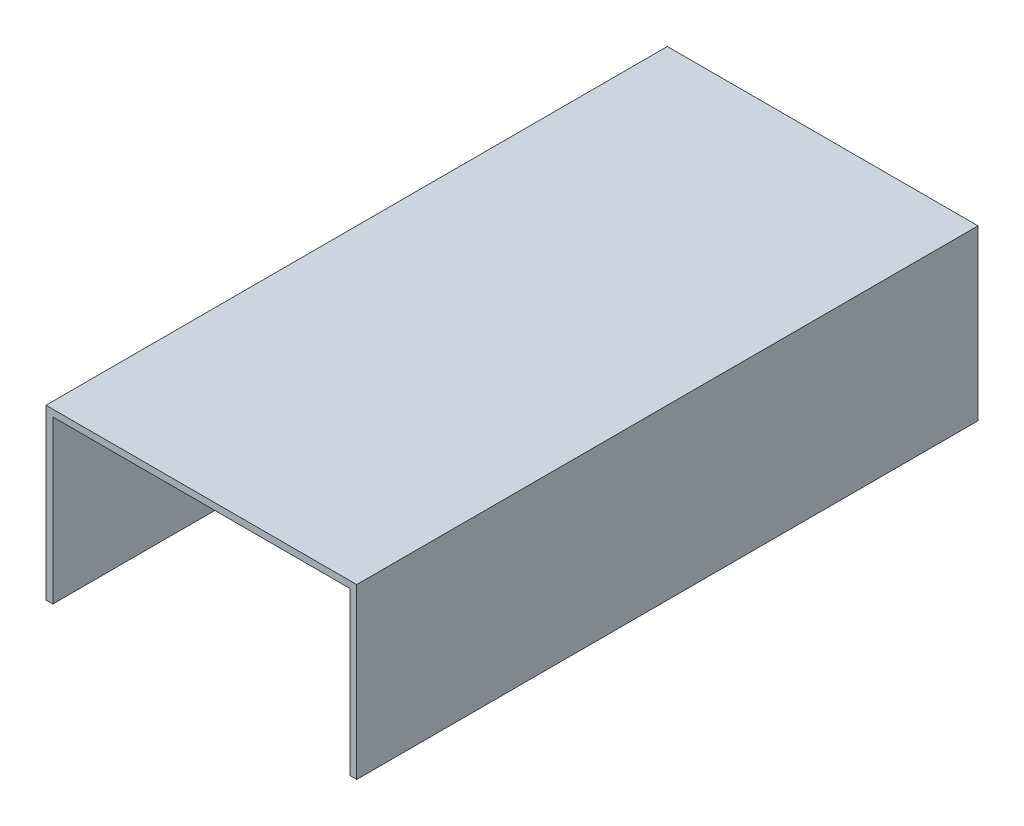
ISO-10303-21;
HEADER;
FILE_DESCRIPTION(('STEP AP214'),'2;1');
FILE_NAME('part.step','',(''),(''),'','','');
FILE_SCHEMA(('AUTOMOTIVE_DESIGN { 1 0 10303 214 1 1 1 1 }'));
ENDSEC;
DATA;
#1=APPLICATION_CONTEXT('core data for automotive mechanical design processes');
#2=APPLICATION_PROTOCOL_DEFINITION('international standard','automotive_design',2000,#1);
#3=PRODUCT_CONTEXT('',#1,'mechanical');
#4=PRODUCT('Part','Part','',(#3));
#5=PRODUCT_RELATED_PRODUCT_CATEGORY('part','',(#4));
#6=PRODUCT_DEFINITION_FORMATION('','',#4);
#7=PRODUCT_DEFINITION_CONTEXT('part definition',#1,'design');
#8=PRODUCT_DEFINITION('design','',#6,#7);
#9=PRODUCT_DEFINITION_SHAPE('','',#8);
#10=(LENGTH_UNIT() NAMED_UNIT(*) SI_UNIT(.MILLI.,.METRE.));
#11=(NAMED_UNIT(*) PLANE_ANGLE_UNIT() SI_UNIT($,.RADIAN.));
#12=(NAMED_UNIT(*) SI_UNIT($,.STERADIAN.) SOLID_ANGLE_UNIT());
#13=UNCERTAINTY_MEASURE_WITH_UNIT(LENGTH_MEASURE(1.E-05),#10,'distance_accuracy_value','');
#14=(GEOMETRIC_REPRESENTATION_CONTEXT(3) GLOBAL_UNCERTAINTY_ASSIGNED_CONTEXT((#13)) GLOBAL_UNIT_ASSIGNED_CONTEXT((#10,
#11,#12)) REPRESENTATION_CONTEXT('',''));
#15=CARTESIAN_POINT('',(0.,0.,0.));
#16=DIRECTION('',(0.,0.,1.));
#17=DIRECTION('',(1.,0.,0.));
#18=AXIS2_PLACEMENT_3D('',#15,#16,#17);
#19=CARTESIAN_POINT('',(142.875,0.,292.1));
#20=DIRECTION('',(-1.,0.,0.));
#21=DIRECTION('',(0.,0.,1.));
#22=AXIS2_PLACEMENT_3D('',#19,#20,#21);
#23=PLANE('',#22);
#24=DIRECTION('',(0.,1.,0.));
#25=VECTOR('',#24,1.);
#26=CARTESIAN_POINT('',(142.875,0.,0.));
#27=LINE('',#26,#25);
#28=CARTESIAN_POINT('',(142.875,0.,0.));
#29=VERTEX_POINT('',#28);
#30=CARTESIAN_POINT('',(142.875,76.2,0.));
#31=VERTEX_POINT('',#30);
#32=EDGE_CURVE('E130',#29,#31,#27,.T.);
#33=ORIENTED_EDGE('',*,*,#32,.F.);
#34=DIRECTION('',(0.,0.,-1.));
#35=VECTOR('',#34,1.);
#36=CARTESIAN_POINT('',(142.875,0.,292.1));
#37=LINE('',#36,#35);
#38=CARTESIAN_POINT('',(142.875,0.,292.1));
#39=VERTEX_POINT('',#38);
#40=EDGE_CURVE('E11',#39,#29,#37,.T.);
#41=ORIENTED_EDGE('',*,*,#40,.F.);
#42=DIRECTION('',(0.,1.,0.));
#43=VECTOR('',#42,1.);
#44=CARTESIAN_POINT('',(142.875,0.,292.1));
#45=LINE('',#44,#43);
#46=CARTESIAN_POINT('',(142.875,76.2,292.1));
#47=VERTEX_POINT('',#46);
#48=EDGE_CURVE('E147',#39,#47,#45,.T.);
#49=ORIENTED_EDGE('',*,*,#48,.T.);
#50=DIRECTION('',(0.,0.,-1.));
#51=VECTOR('',#50,1.);
#52=CARTESIAN_POINT('',(142.875,76.2,292.1));
#53=LINE('',#52,#51);
#54=EDGE_CURVE('E86',#47,#31,#53,.T.);
#55=ORIENTED_EDGE('',*,*,#54,.T.);
#56=EDGE_LOOP('',(#33,#41,#49,#55));
#57=FACE_BOUND('',#56,.T.);
#58=ADVANCED_FACE('F35',(#57),#23,.T.);
#59=CARTESIAN_POINT('',(0.,0.,292.1));
#60=DIRECTION('',(0.,1.,0.));
#61=DIRECTION('',(0.,0.,1.));
#62=AXIS2_PLACEMENT_3D('',#59,#60,#61);
#63=PLANE('',#62);
#64=DIRECTION('',(1.,0.,0.));
#65=VECTOR('',#64,1.);
#66=CARTESIAN_POINT('',(0.,0.,0.));
#67=LINE('',#66,#65);
#68=CARTESIAN_POINT('',(146.05,0.,0.));
#69=VERTEX_POINT('',#68);
#70=EDGE_CURVE('E133',#29,#69,#67,.T.);
#71=ORIENTED_EDGE('',*,*,#70,.T.);
#72=DIRECTION('',(0.,0.,-1.));
#73=VECTOR('',#72,1.);
#74=CARTESIAN_POINT('',(146.05,0.,292.1));
#75=LINE('',#74,#73);
#76=CARTESIAN_POINT('',(146.05,0.,292.1));
#77=VERTEX_POINT('',#76);
#78=EDGE_CURVE('E43',#77,#69,#75,.T.);
#79=ORIENTED_EDGE('',*,*,#78,.F.);
#80=DIRECTION('',(1.,0.,0.));
#81=VECTOR('',#80,1.);
#82=CARTESIAN_POINT('',(0.,0.,292.1));
#83=LINE('',#82,#81);
#84=EDGE_CURVE('E116',#39,#77,#83,.T.);
#85=ORIENTED_EDGE('',*,*,#84,.F.);
#86=ORIENTED_EDGE('',*,*,#40,.T.);
#87=EDGE_LOOP('',(#71,#79,#85,#86));
#88=FACE_BOUND('',#87,.T.);
#89=ADVANCED_FACE('F174',(#88),#63,.F.);
#90=CARTESIAN_POINT('',(146.05,0.,292.1));
#91=DIRECTION('',(-1.,0.,0.));
#92=DIRECTION('',(0.,0.,1.));
#93=AXIS2_PLACEMENT_3D('',#90,#91,#92);
#94=PLANE('',#93);
#95=DIRECTION('',(0.,1.,0.));
#96=VECTOR('',#95,1.);
#97=CARTESIAN_POINT('',(146.05,0.,0.));
#98=LINE('',#97,#96);
#99=CARTESIAN_POINT('',(146.05,79.375,0.));
#100=VERTEX_POINT('',#99);
#101=EDGE_CURVE('E135',#69,#100,#98,.T.);
#102=ORIENTED_EDGE('',*,*,#101,.T.);
#103=DIRECTION('',(0.,0.,-1.));
#104=VECTOR('',#103,1.);
#105=CARTESIAN_POINT('',(146.05,79.375,292.1));
#106=LINE('',#105,#104);
#107=CARTESIAN_POINT('',(146.05,79.375,292.1));
#108=VERTEX_POINT('',#107);
#109=EDGE_CURVE('E153',#108,#100,#106,.T.);
#110=ORIENTED_EDGE('',*,*,#109,.F.);
#111=DIRECTION('',(0.,1.,0.));
#112=VECTOR('',#111,1.);
#113=CARTESIAN_POINT('',(146.05,0.,292.1));
#114=LINE('',#113,#112);
#115=EDGE_CURVE('E161',#77,#108,#114,.T.);
#116=ORIENTED_EDGE('',*,*,#115,.F.);
#117=ORIENTED_EDGE('',*,*,#78,.T.);
#118=EDGE_LOOP('',(#102,#110,#116,#117));
#119=FACE_BOUND('',#118,.T.);
#120=ADVANCED_FACE('F159',(#119),#94,.F.);
#121=CARTESIAN_POINT('',(0.,79.375,292.1));
#122=DIRECTION('',(0.,1.,0.));
#123=DIRECTION('',(0.,0.,1.));
#124=AXIS2_PLACEMENT_3D('',#121,#122,#123);
#125=PLANE('',#124);
#126=DIRECTION('',(1.,0.,0.));
#127=VECTOR('',#126,1.);
#128=CARTESIAN_POINT('',(0.,79.375,0.));
#129=LINE('',#128,#127);
#130=CARTESIAN_POINT('',(0.,79.375,0.));
#131=VERTEX_POINT('',#130);
#132=EDGE_CURVE('E138',#131,#100,#129,.T.);
#133=ORIENTED_EDGE('',*,*,#132,.F.);
#134=DIRECTION('',(0.,0.,-1.));
#135=VECTOR('',#134,1.);
#136=CARTESIAN_POINT('',(0.,79.375,292.1));
#137=LINE('',#136,#135);
#138=CARTESIAN_POINT('',(0.,79.375,292.1));
#139=VERTEX_POINT('',#138);
#140=EDGE_CURVE('E151',#139,#131,#137,.T.);
#141=ORIENTED_EDGE('',*,*,#140,.F.);
#142=DIRECTION('',(1.,0.,0.));
#143=VECTOR('',#142,1.);
#144=CARTESIAN_POINT('',(0.,79.375,292.1));
#145=LINE('',#144,#143);
#146=EDGE_CURVE('E171',#139,#108,#145,.T.);
#147=ORIENTED_EDGE('',*,*,#146,.T.);
#148=ORIENTED_EDGE('',*,*,#109,.T.);
#149=EDGE_LOOP('',(#133,#141,#147,#148));
#150=FACE_BOUND('',#149,.T.);
#151=ADVANCED_FACE('F169',(#150),#125,.T.);
#152=CARTESIAN_POINT('',(0.,0.,292.1));
#153=DIRECTION('',(-1.,0.,0.));
#154=DIRECTION('',(0.,0.,1.));
#155=AXIS2_PLACEMENT_3D('',#152,#153,#154);
#156=PLANE('',#155);
#157=DIRECTION('',(0.,1.,0.));
#158=VECTOR('',#157,1.);
#159=CARTESIAN_POINT('',(0.,0.,0.));
#160=LINE('',#159,#158);
#161=CARTESIAN_POINT('',(0.,0.,0.));
#162=VERTEX_POINT('',#161);
#163=EDGE_CURVE('E141',#162,#131,#160,.T.);
#164=ORIENTED_EDGE('',*,*,#163,.F.);
#165=DIRECTION('',(0.,0.,-1.));
#166=VECTOR('',#165,1.);
#167=CARTESIAN_POINT('',(0.,0.,292.1));
#168=LINE('',#167,#166);
#169=CARTESIAN_POINT('',(0.,0.,292.1));
#170=VERTEX_POINT('',#169);
#171=EDGE_CURVE('E121',#170,#162,#168,.T.);
#172=ORIENTED_EDGE('',*,*,#171,.F.);
#173=DIRECTION('',(0.,1.,0.));
#174=VECTOR('',#173,1.);
#175=CARTESIAN_POINT('',(0.,0.,292.1));
#176=LINE('',#175,#174);
#177=EDGE_CURVE('E113',#170,#139,#176,.T.);
#178=ORIENTED_EDGE('',*,*,#177,.T.);
#179=ORIENTED_EDGE('',*,*,#140,.T.);
#180=EDGE_LOOP('',(#164,#172,#178,#179));
#181=FACE_BOUND('',#180,.T.);
#182=ADVANCED_FACE('F184',(#181),#156,.T.);
#183=CARTESIAN_POINT('',(3.17499999999999,0.,0.));
#184=VERTEX_POINT('',#183);
#185=EDGE_CURVE('E120',#162,#184,#67,.T.);
#186=ORIENTED_EDGE('',*,*,#185,.T.);
#187=DIRECTION('',(0.,0.,-1.));
#188=VECTOR('',#187,1.);
#189=CARTESIAN_POINT('',(3.17499999999999,0.,292.1));
#190=LINE('',#189,#188);
#191=CARTESIAN_POINT('',(3.17499999999999,0.,292.1));
#192=VERTEX_POINT('',#191);
#193=EDGE_CURVE('E117',#192,#184,#190,.T.);
#194=ORIENTED_EDGE('',*,*,#193,.F.);
#195=EDGE_CURVE('E106',#170,#192,#83,.T.);
#196=ORIENTED_EDGE('',*,*,#195,.F.);
#197=ORIENTED_EDGE('',*,*,#171,.T.);
#198=EDGE_LOOP('',(#186,#194,#196,#197));
#199=FACE_BOUND('',#198,.T.);
#200=ADVANCED_FACE('F118',(#199),#63,.F.);
#201=CARTESIAN_POINT('',(3.17499999999999,0.,292.1));
#202=DIRECTION('',(-1.,0.,0.));
#203=DIRECTION('',(0.,-1.,0.));
#204=AXIS2_PLACEMENT_3D('',#201,#202,#203);
#205=PLANE('',#204);
#206=DIRECTION('',(0.,1.,0.));
#207=VECTOR('',#206,1.);
#208=CARTESIAN_POINT('',(3.17499999999999,0.,0.));
#209=LINE('',#208,#207);
#210=CARTESIAN_POINT('',(3.17499999999999,76.2,0.));
#211=VERTEX_POINT('',#210);
#212=EDGE_CURVE('E79',#184,#211,#209,.T.);
#213=ORIENTED_EDGE('',*,*,#212,.T.);
#214=DIRECTION('',(0.,0.,-1.));
#215=VECTOR('',#214,1.);
#216=CARTESIAN_POINT('',(3.17499999999999,76.2,292.1));
#217=LINE('',#216,#215);
#218=CARTESIAN_POINT('',(3.17499999999999,76.2,292.1));
#219=VERTEX_POINT('',#218);
#220=EDGE_CURVE('E122',#219,#211,#217,.T.);
#221=ORIENTED_EDGE('',*,*,#220,.F.);
#222=DIRECTION('',(0.,1.,0.));
#223=VECTOR('',#222,1.);
#224=CARTESIAN_POINT('',(3.17499999999999,0.,292.1));
#225=LINE('',#224,#223);
#226=EDGE_CURVE('E110',#192,#219,#225,.T.);
#227=ORIENTED_EDGE('',*,*,#226,.F.);
#228=ORIENTED_EDGE('',*,*,#193,.T.);
#229=EDGE_LOOP('',(#213,#221,#227,#228));
#230=FACE_BOUND('',#229,.T.);
#231=ADVANCED_FACE('F124',(#230),#205,.F.);
#232=CARTESIAN_POINT('',(0.,76.2,292.1));
#233=DIRECTION('',(0.,1.,0.));
#234=DIRECTION('',(0.,0.,1.));
#235=AXIS2_PLACEMENT_3D('',#232,#233,#234);
#236=PLANE('',#235);
#237=DIRECTION('',(1.,0.,0.));
#238=VECTOR('',#237,1.);
#239=CARTESIAN_POINT('',(0.,76.2,0.));
#240=LINE('',#239,#238);
#241=EDGE_CURVE('E145',#211,#31,#240,.T.);
#242=ORIENTED_EDGE('',*,*,#241,.T.);
#243=ORIENTED_EDGE('',*,*,#54,.F.);
#244=DIRECTION('',(1.,0.,0.));
#245=VECTOR('',#244,1.);
#246=CARTESIAN_POINT('',(0.,76.2,292.1));
#247=LINE('',#246,#245);
#248=EDGE_CURVE('E51',#219,#47,#247,.T.);
#249=ORIENTED_EDGE('',*,*,#248,.F.);
#250=ORIENTED_EDGE('',*,*,#220,.T.);
#251=EDGE_LOOP('',(#242,#243,#249,#250));
#252=FACE_BOUND('',#251,.T.);
#253=ADVANCED_FACE('F189',(#252),#236,.F.);
#254=CARTESIAN_POINT('',(0.,0.,292.1));
#255=DIRECTION('',(0.,0.,1.));
#256=DIRECTION('',(1.,0.,0.));
#257=AXIS2_PLACEMENT_3D('',#254,#255,#256);
#258=PLANE('',#257);
#259=ORIENTED_EDGE('',*,*,#48,.F.);
#260=ORIENTED_EDGE('',*,*,#84,.T.);
#261=ORIENTED_EDGE('',*,*,#115,.T.);
#262=ORIENTED_EDGE('',*,*,#146,.F.);
#263=ORIENTED_EDGE('',*,*,#177,.F.);
#264=ORIENTED_EDGE('',*,*,#195,.T.);
#265=ORIENTED_EDGE('',*,*,#226,.T.);
#266=ORIENTED_EDGE('',*,*,#248,.T.);
#267=EDGE_LOOP('',(#259,#260,#261,#262,#263,#264,#265,#266));
#268=FACE_BOUND('',#267,.T.);
#269=ADVANCED_FACE('F108',(#268),#258,.T.);
#270=CARTESIAN_POINT('',(0.,0.,0.));
#271=DIRECTION('',(0.,0.,1.));
#272=DIRECTION('',(1.,0.,0.));
#273=AXIS2_PLACEMENT_3D('',#270,#271,#272);
#274=PLANE('',#273);
#275=ORIENTED_EDGE('',*,*,#32,.T.);
#276=ORIENTED_EDGE('',*,*,#241,.F.);
#277=ORIENTED_EDGE('',*,*,#212,.F.);
#278=ORIENTED_EDGE('',*,*,#185,.F.);
#279=ORIENTED_EDGE('',*,*,#163,.T.);
#280=ORIENTED_EDGE('',*,*,#132,.T.);
#281=ORIENTED_EDGE('',*,*,#101,.F.);
#282=ORIENTED_EDGE('',*,*,#70,.F.);
#283=EDGE_LOOP('',(#275,#276,#277,#278,#279,#280,#281,#282));
#284=FACE_BOUND('',#283,.T.);
#285=ADVANCED_FACE('F165',(#284),#274,.F.);
#286=CLOSED_SHELL('',(#58,#89,#120,#151,#182,#200,#231,#253,#269,#285));
#287=MANIFOLD_SOLID_BREP('B2',#286);
#288=ADVANCED_BREP_SHAPE_REPRESENTATION('',(#18,#287),#14);
#289=SHAPE_DEFINITION_REPRESENTATION(#9,#288);
ENDSEC;
END-ISO-10303-21;
